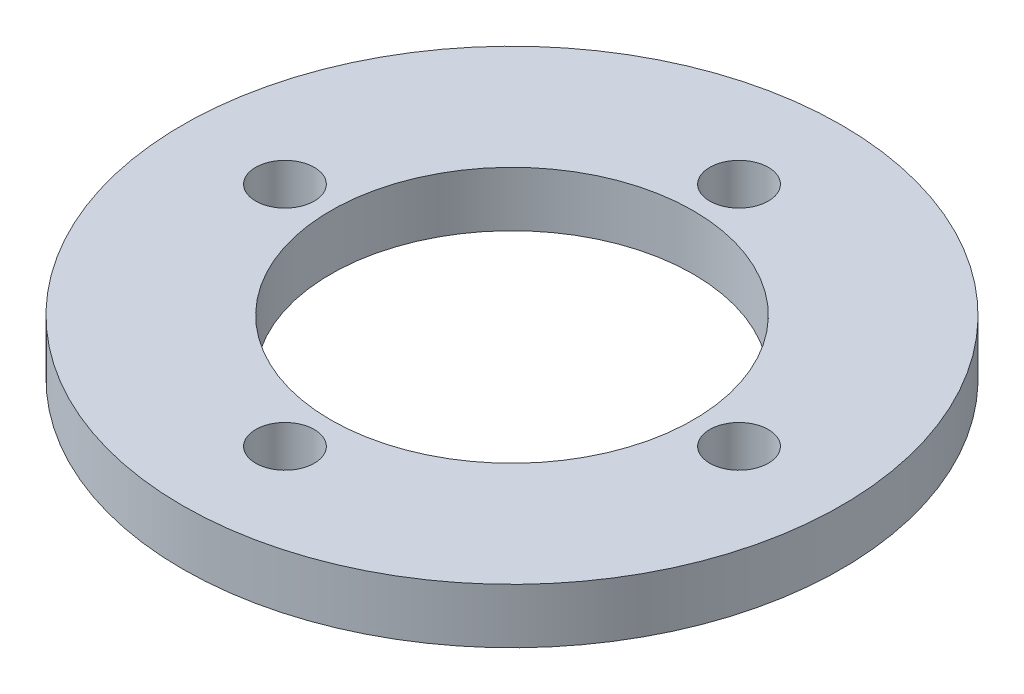
ISO-10303-21;
HEADER;
FILE_DESCRIPTION(('STEP AP214'),'2;1');
FILE_NAME('part.step','',(''),(''),'','','');
FILE_SCHEMA(('AUTOMOTIVE_DESIGN { 1 0 10303 214 1 1 1 1 }'));
ENDSEC;
DATA;
#1=APPLICATION_CONTEXT('core data for automotive mechanical design processes');
#2=APPLICATION_PROTOCOL_DEFINITION('international standard','automotive_design',2000,#1);
#3=PRODUCT_CONTEXT('',#1,'mechanical');
#4=PRODUCT('Part','Part','',(#3));
#5=PRODUCT_RELATED_PRODUCT_CATEGORY('part','',(#4));
#6=PRODUCT_DEFINITION_FORMATION('','',#4);
#7=PRODUCT_DEFINITION_CONTEXT('part definition',#1,'design');
#8=PRODUCT_DEFINITION('design','',#6,#7);
#9=PRODUCT_DEFINITION_SHAPE('','',#8);
#10=(LENGTH_UNIT() NAMED_UNIT(*) SI_UNIT(.MILLI.,.METRE.));
#11=(NAMED_UNIT(*) PLANE_ANGLE_UNIT() SI_UNIT($,.RADIAN.));
#12=(NAMED_UNIT(*) SI_UNIT($,.STERADIAN.) SOLID_ANGLE_UNIT());
#13=UNCERTAINTY_MEASURE_WITH_UNIT(LENGTH_MEASURE(1.E-05),#10,'distance_accuracy_value','');
#14=(GEOMETRIC_REPRESENTATION_CONTEXT(3) GLOBAL_UNCERTAINTY_ASSIGNED_CONTEXT((#13)) GLOBAL_UNIT_ASSIGNED_CONTEXT((#10,
#11,#12)) REPRESENTATION_CONTEXT('',''));
#15=CARTESIAN_POINT('',(0.,0.,0.));
#16=DIRECTION('',(0.,0.,1.));
#17=DIRECTION('',(1.,0.,0.));
#18=AXIS2_PLACEMENT_3D('',#15,#16,#17);
#19=CARTESIAN_POINT('',(0.,3.,0.));
#20=DIRECTION('',(0.,1.,0.));
#21=DIRECTION('',(0.,0.,1.));
#22=AXIS2_PLACEMENT_3D('',#19,#20,#21);
#23=PLANE('',#22);
#24=CARTESIAN_POINT('',(0.,3.,12.4));
#25=DIRECTION('',(0.,1.,0.));
#26=DIRECTION('',(0.,0.,1.));
#27=AXIS2_PLACEMENT_3D('',#24,#25,#26);
#28=CIRCLE('',#27,1.6);
#29=CARTESIAN_POINT('',(0.,3.,14.));
#30=VERTEX_POINT('',#29);
#31=EDGE_CURVE('E67',#30,#30,#28,.T.);
#32=ORIENTED_EDGE('',*,*,#31,.F.);
#33=EDGE_LOOP('',(#32));
#34=FACE_BOUND('',#33,.T.);
#35=CARTESIAN_POINT('',(0.,3.,-12.4));
#36=DIRECTION('',(0.,1.,0.));
#37=DIRECTION('',(0.,0.,1.));
#38=AXIS2_PLACEMENT_3D('',#35,#36,#37);
#39=CIRCLE('',#38,1.6);
#40=CARTESIAN_POINT('',(0.,3.,-10.8));
#41=VERTEX_POINT('',#40);
#42=EDGE_CURVE('E55',#41,#41,#39,.T.);
#43=ORIENTED_EDGE('',*,*,#42,.F.);
#44=EDGE_LOOP('',(#43));
#45=FACE_BOUND('',#44,.T.);
#46=CARTESIAN_POINT('',(0.,3.,0.));
#47=DIRECTION('',(0.,1.,0.));
#48=DIRECTION('',(0.,0.,1.));
#49=AXIS2_PLACEMENT_3D('',#46,#47,#48);
#50=CIRCLE('',#49,18.);
#51=CARTESIAN_POINT('',(0.,3.,18.));
#52=VERTEX_POINT('',#51);
#53=EDGE_CURVE('E10',#52,#52,#50,.T.);
#54=ORIENTED_EDGE('',*,*,#53,.T.);
#55=EDGE_LOOP('',(#54));
#56=FACE_BOUND('',#55,.T.);
#57=CARTESIAN_POINT('',(0.,3.,0.));
#58=DIRECTION('',(0.,1.,0.));
#59=DIRECTION('',(0.,0.,1.));
#60=AXIS2_PLACEMENT_3D('',#57,#58,#59);
#61=CIRCLE('',#60,9.9);
#62=CARTESIAN_POINT('',(0.,3.,9.9));
#63=VERTEX_POINT('',#62);
#64=EDGE_CURVE('E50',#63,#63,#61,.T.);
#65=ORIENTED_EDGE('',*,*,#64,.F.);
#66=EDGE_LOOP('',(#65));
#67=FACE_BOUND('',#66,.T.);
#68=CARTESIAN_POINT('',(12.4,3.,0.));
#69=DIRECTION('',(0.,1.,0.));
#70=DIRECTION('',(0.,0.,1.));
#71=AXIS2_PLACEMENT_3D('',#68,#69,#70);
#72=CIRCLE('',#71,1.6);
#73=CARTESIAN_POINT('',(12.4,3.,1.60000000000004));
#74=VERTEX_POINT('',#73);
#75=EDGE_CURVE('E61',#74,#74,#72,.T.);
#76=ORIENTED_EDGE('',*,*,#75,.F.);
#77=EDGE_LOOP('',(#76));
#78=FACE_BOUND('',#77,.T.);
#79=CARTESIAN_POINT('',(-12.4,3.,0.));
#80=DIRECTION('',(0.,1.,0.));
#81=DIRECTION('',(0.,0.,1.));
#82=AXIS2_PLACEMENT_3D('',#79,#80,#81);
#83=CIRCLE('',#82,1.6);
#84=CARTESIAN_POINT('',(-12.4,3.,1.6));
#85=VERTEX_POINT('',#84);
#86=EDGE_CURVE('E73',#85,#85,#83,.T.);
#87=ORIENTED_EDGE('',*,*,#86,.F.);
#88=EDGE_LOOP('',(#87));
#89=FACE_BOUND('',#88,.T.);
#90=ADVANCED_FACE('F39',(#34,#45,#56,#67,#78,#89),#23,.T.);
#91=CARTESIAN_POINT('',(0.,0.,0.));
#92=DIRECTION('',(0.,1.,0.));
#93=DIRECTION('',(0.,0.,1.));
#94=AXIS2_PLACEMENT_3D('',#91,#92,#93);
#95=PLANE('',#94);
#96=CARTESIAN_POINT('',(0.,0.,0.));
#97=DIRECTION('',(0.,1.,0.));
#98=DIRECTION('',(0.,0.,1.));
#99=AXIS2_PLACEMENT_3D('',#96,#97,#98);
#100=CIRCLE('',#99,18.);
#101=CARTESIAN_POINT('',(0.,0.,18.));
#102=VERTEX_POINT('',#101);
#103=EDGE_CURVE('E43',#102,#102,#100,.T.);
#104=ORIENTED_EDGE('',*,*,#103,.F.);
#105=EDGE_LOOP('',(#104));
#106=FACE_BOUND('',#105,.T.);
#107=CARTESIAN_POINT('',(0.,0.,0.));
#108=DIRECTION('',(0.,1.,0.));
#109=DIRECTION('',(0.,0.,1.));
#110=AXIS2_PLACEMENT_3D('',#107,#108,#109);
#111=CIRCLE('',#110,9.9);
#112=CARTESIAN_POINT('',(0.,0.,9.9));
#113=VERTEX_POINT('',#112);
#114=EDGE_CURVE('E52',#113,#113,#111,.T.);
#115=ORIENTED_EDGE('',*,*,#114,.T.);
#116=EDGE_LOOP('',(#115));
#117=FACE_BOUND('',#116,.T.);
#118=CARTESIAN_POINT('',(0.,0.,-12.4));
#119=DIRECTION('',(0.,1.,0.));
#120=DIRECTION('',(0.,0.,1.));
#121=AXIS2_PLACEMENT_3D('',#118,#119,#120);
#122=CIRCLE('',#121,1.6);
#123=CARTESIAN_POINT('',(0.,0.,-10.8));
#124=VERTEX_POINT('',#123);
#125=EDGE_CURVE('E58',#124,#124,#122,.T.);
#126=ORIENTED_EDGE('',*,*,#125,.T.);
#127=EDGE_LOOP('',(#126));
#128=FACE_BOUND('',#127,.T.);
#129=CARTESIAN_POINT('',(12.4,0.,0.));
#130=DIRECTION('',(0.,1.,0.));
#131=DIRECTION('',(0.,0.,1.));
#132=AXIS2_PLACEMENT_3D('',#129,#130,#131);
#133=CIRCLE('',#132,1.6);
#134=CARTESIAN_POINT('',(12.4,0.,1.60000000000004));
#135=VERTEX_POINT('',#134);
#136=EDGE_CURVE('E64',#135,#135,#133,.T.);
#137=ORIENTED_EDGE('',*,*,#136,.T.);
#138=EDGE_LOOP('',(#137));
#139=FACE_BOUND('',#138,.T.);
#140=CARTESIAN_POINT('',(0.,0.,12.4));
#141=DIRECTION('',(0.,1.,0.));
#142=DIRECTION('',(0.,0.,1.));
#143=AXIS2_PLACEMENT_3D('',#140,#141,#142);
#144=CIRCLE('',#143,1.6);
#145=CARTESIAN_POINT('',(0.,0.,14.));
#146=VERTEX_POINT('',#145);
#147=EDGE_CURVE('E70',#146,#146,#144,.T.);
#148=ORIENTED_EDGE('',*,*,#147,.T.);
#149=EDGE_LOOP('',(#148));
#150=FACE_BOUND('',#149,.T.);
#151=CARTESIAN_POINT('',(-12.4,0.,0.));
#152=DIRECTION('',(0.,1.,0.));
#153=DIRECTION('',(0.,0.,1.));
#154=AXIS2_PLACEMENT_3D('',#151,#152,#153);
#155=CIRCLE('',#154,1.6);
#156=CARTESIAN_POINT('',(-12.4,0.,1.6));
#157=VERTEX_POINT('',#156);
#158=EDGE_CURVE('E76',#157,#157,#155,.T.);
#159=ORIENTED_EDGE('',*,*,#158,.T.);
#160=EDGE_LOOP('',(#159));
#161=FACE_BOUND('',#160,.T.);
#162=ADVANCED_FACE('F86',(#106,#117,#128,#139,#150,#161),#95,.F.);
#163=CARTESIAN_POINT('',(0.,3.,0.));
#164=DIRECTION('',(0.,-1.,0.));
#165=DIRECTION('',(0.,0.,-1.));
#166=AXIS2_PLACEMENT_3D('',#163,#164,#165);
#167=CYLINDRICAL_SURFACE('',#166,18.);
#168=ORIENTED_EDGE('',*,*,#53,.F.);
#169=EDGE_LOOP('',(#168));
#170=FACE_BOUND('',#169,.T.);
#171=ORIENTED_EDGE('',*,*,#103,.T.);
#172=EDGE_LOOP('',(#171));
#173=FACE_BOUND('',#172,.T.);
#174=ADVANCED_FACE('F41',(#170,#173),#167,.T.);
#175=CARTESIAN_POINT('',(0.,3.,0.));
#176=DIRECTION('',(0.,-1.,0.));
#177=DIRECTION('',(0.,0.,-1.));
#178=AXIS2_PLACEMENT_3D('',#175,#176,#177);
#179=CYLINDRICAL_SURFACE('',#178,9.9);
#180=ORIENTED_EDGE('',*,*,#64,.T.);
#181=EDGE_LOOP('',(#180));
#182=FACE_BOUND('',#181,.T.);
#183=ORIENTED_EDGE('',*,*,#114,.F.);
#184=EDGE_LOOP('',(#183));
#185=FACE_BOUND('',#184,.T.);
#186=ADVANCED_FACE('F96',(#182,#185),#179,.F.);
#187=CARTESIAN_POINT('',(0.,3.,-12.4));
#188=DIRECTION('',(0.,-1.,0.));
#189=DIRECTION('',(0.,0.,-1.));
#190=AXIS2_PLACEMENT_3D('',#187,#188,#189);
#191=CYLINDRICAL_SURFACE('',#190,1.6);
#192=ORIENTED_EDGE('',*,*,#42,.T.);
#193=EDGE_LOOP('',(#192));
#194=FACE_BOUND('',#193,.T.);
#195=ORIENTED_EDGE('',*,*,#125,.F.);
#196=EDGE_LOOP('',(#195));
#197=FACE_BOUND('',#196,.T.);
#198=ADVANCED_FACE('F99',(#194,#197),#191,.F.);
#199=CARTESIAN_POINT('',(12.4,3.,0.));
#200=DIRECTION('',(0.,-1.,0.));
#201=DIRECTION('',(0.,0.,-1.));
#202=AXIS2_PLACEMENT_3D('',#199,#200,#201);
#203=CYLINDRICAL_SURFACE('',#202,1.6);
#204=ORIENTED_EDGE('',*,*,#75,.T.);
#205=EDGE_LOOP('',(#204));
#206=FACE_BOUND('',#205,.T.);
#207=ORIENTED_EDGE('',*,*,#136,.F.);
#208=EDGE_LOOP('',(#207));
#209=FACE_BOUND('',#208,.T.);
#210=ADVANCED_FACE('F103',(#206,#209),#203,.F.);
#211=CARTESIAN_POINT('',(0.,3.,12.4));
#212=DIRECTION('',(0.,-1.,0.));
#213=DIRECTION('',(0.,0.,-1.));
#214=AXIS2_PLACEMENT_3D('',#211,#212,#213);
#215=CYLINDRICAL_SURFACE('',#214,1.6);
#216=ORIENTED_EDGE('',*,*,#31,.T.);
#217=EDGE_LOOP('',(#216));
#218=FACE_BOUND('',#217,.T.);
#219=ORIENTED_EDGE('',*,*,#147,.F.);
#220=EDGE_LOOP('',(#219));
#221=FACE_BOUND('',#220,.T.);
#222=ADVANCED_FACE('F107',(#218,#221),#215,.F.);
#223=CARTESIAN_POINT('',(-12.4,3.,0.));
#224=DIRECTION('',(0.,-1.,0.));
#225=DIRECTION('',(0.,0.,-1.));
#226=AXIS2_PLACEMENT_3D('',#223,#224,#225);
#227=CYLINDRICAL_SURFACE('',#226,1.6);
#228=ORIENTED_EDGE('',*,*,#86,.T.);
#229=EDGE_LOOP('',(#228));
#230=FACE_BOUND('',#229,.T.);
#231=ORIENTED_EDGE('',*,*,#158,.F.);
#232=EDGE_LOOP('',(#231));
#233=FACE_BOUND('',#232,.T.);
#234=ADVANCED_FACE('F82',(#230,#233),#227,.F.);
#235=CLOSED_SHELL('',(#90,#162,#174,#186,#198,#210,#222,#234));
#236=MANIFOLD_SOLID_BREP('B2',#235);
#237=ADVANCED_BREP_SHAPE_REPRESENTATION('',(#18,#236),#14);
#238=SHAPE_DEFINITION_REPRESENTATION(#9,#237);
ENDSEC;
END-ISO-10303-21;
